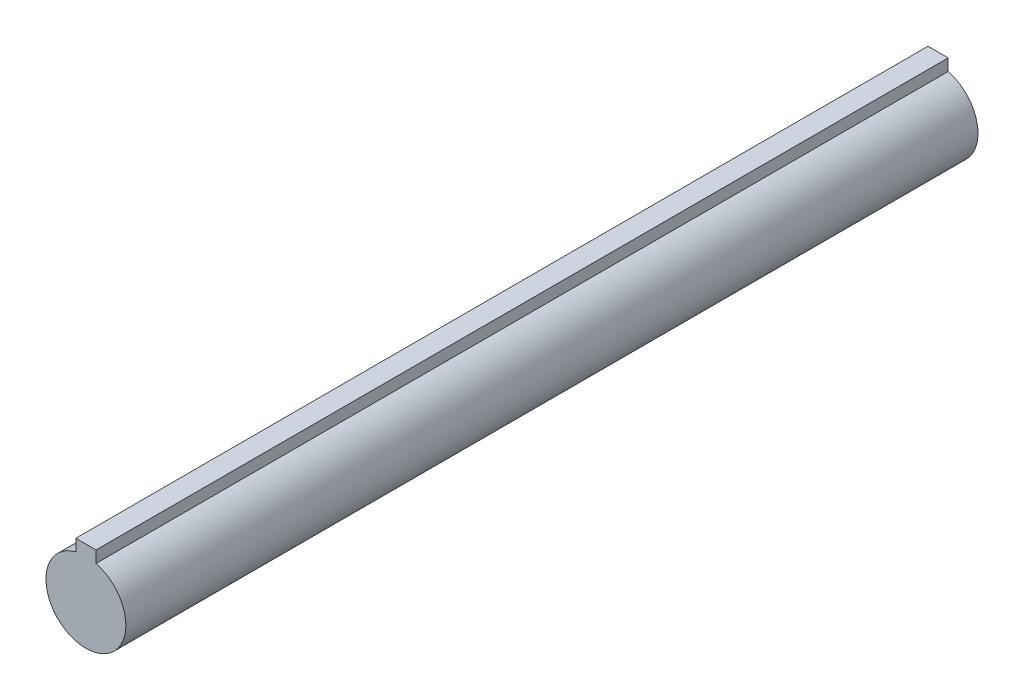
ISO-10303-21;
HEADER;
FILE_DESCRIPTION(('STEP AP214'),'2;1');
FILE_NAME('part.step','',(''),(''),'','','');
FILE_SCHEMA(('AUTOMOTIVE_DESIGN { 1 0 10303 214 1 1 1 1 }'));
ENDSEC;
DATA;
#1=APPLICATION_CONTEXT('core data for automotive mechanical design processes');
#2=APPLICATION_PROTOCOL_DEFINITION('international standard','automotive_design',2000,#1);
#3=PRODUCT_CONTEXT('',#1,'mechanical');
#4=PRODUCT('Part','Part','',(#3));
#5=PRODUCT_RELATED_PRODUCT_CATEGORY('part','',(#4));
#6=PRODUCT_DEFINITION_FORMATION('','',#4);
#7=PRODUCT_DEFINITION_CONTEXT('part definition',#1,'design');
#8=PRODUCT_DEFINITION('design','',#6,#7);
#9=PRODUCT_DEFINITION_SHAPE('','',#8);
#10=(LENGTH_UNIT() NAMED_UNIT(*) SI_UNIT(.MILLI.,.METRE.));
#11=(NAMED_UNIT(*) PLANE_ANGLE_UNIT() SI_UNIT($,.RADIAN.));
#12=(NAMED_UNIT(*) SI_UNIT($,.STERADIAN.) SOLID_ANGLE_UNIT());
#13=UNCERTAINTY_MEASURE_WITH_UNIT(LENGTH_MEASURE(1.E-05),#10,'distance_accuracy_value','');
#14=(GEOMETRIC_REPRESENTATION_CONTEXT(3) GLOBAL_UNCERTAINTY_ASSIGNED_CONTEXT((#13)) GLOBAL_UNIT_ASSIGNED_CONTEXT((#10,
#11,#12)) REPRESENTATION_CONTEXT('',''));
#15=CARTESIAN_POINT('',(0.,0.,0.));
#16=DIRECTION('',(0.,0.,1.));
#17=DIRECTION('',(1.,0.,0.));
#18=AXIS2_PLACEMENT_3D('',#15,#16,#17);
#19=CARTESIAN_POINT('',(0.,0.,203.2));
#20=DIRECTION('',(0.,0.,-1.));
#21=DIRECTION('',(-1.,0.,0.));
#22=AXIS2_PLACEMENT_3D('',#19,#20,#21);
#23=CYLINDRICAL_SURFACE('',#22,9.525);
#24=CARTESIAN_POINT('',(0.,0.,0.));
#25=DIRECTION('',(0.,0.,1.));
#26=DIRECTION('',(1.,0.,0.));
#27=AXIS2_PLACEMENT_3D('',#24,#25,#26);
#28=CIRCLE('',#27,9.525);
#29=CARTESIAN_POINT('',(-2.413,9.21428543078626,0.));
#30=VERTEX_POINT('',#29);
#31=CARTESIAN_POINT('',(2.413,9.21428543078626,0.));
#32=VERTEX_POINT('',#31);
#33=EDGE_CURVE('E107',#30,#32,#28,.T.);
#34=ORIENTED_EDGE('',*,*,#33,.T.);
#35=DIRECTION('',(0.,0.,-1.));
#36=VECTOR('',#35,1.);
#37=CARTESIAN_POINT('',(2.413,9.21428543078626,203.2));
#38=LINE('',#37,#36);
#39=CARTESIAN_POINT('',(2.413,9.21428543078626,203.2));
#40=VERTEX_POINT('',#39);
#41=EDGE_CURVE('E11',#40,#32,#38,.T.);
#42=ORIENTED_EDGE('',*,*,#41,.F.);
#43=CARTESIAN_POINT('',(0.,0.,203.2));
#44=DIRECTION('',(0.,0.,1.));
#45=DIRECTION('',(1.,0.,0.));
#46=AXIS2_PLACEMENT_3D('',#43,#44,#45);
#47=CIRCLE('',#46,9.525);
#48=CARTESIAN_POINT('',(-2.413,9.21428543078626,203.2));
#49=VERTEX_POINT('',#48);
#50=EDGE_CURVE('E91',#49,#40,#47,.T.);
#51=ORIENTED_EDGE('',*,*,#50,.F.);
#52=DIRECTION('',(0.,0.,-1.));
#53=VECTOR('',#52,1.);
#54=CARTESIAN_POINT('',(-2.413,9.21428543078626,203.2));
#55=LINE('',#54,#53);
#56=EDGE_CURVE('E103',#49,#30,#55,.T.);
#57=ORIENTED_EDGE('',*,*,#56,.T.);
#58=EDGE_LOOP('',(#34,#42,#51,#57));
#59=FACE_BOUND('',#58,.T.);
#60=ADVANCED_FACE('F39',(#59),#23,.T.);
#61=CARTESIAN_POINT('',(2.413,12.0082854307863,203.2));
#62=DIRECTION('',(-1.,0.,0.));
#63=DIRECTION('',(0.,-1.,0.));
#64=AXIS2_PLACEMENT_3D('',#61,#62,#63);
#65=PLANE('',#64);
#66=DIRECTION('',(0.,1.,0.));
#67=VECTOR('',#66,1.);
#68=CARTESIAN_POINT('',(2.413,12.0082854307863,0.));
#69=LINE('',#68,#67);
#70=CARTESIAN_POINT('',(2.413,12.0082854307863,0.));
#71=VERTEX_POINT('',#70);
#72=EDGE_CURVE('E96',#32,#71,#69,.T.);
#73=ORIENTED_EDGE('',*,*,#72,.T.);
#74=DIRECTION('',(0.,0.,-1.));
#75=VECTOR('',#74,1.);
#76=CARTESIAN_POINT('',(2.413,12.0082854307863,203.2));
#77=LINE('',#76,#75);
#78=CARTESIAN_POINT('',(2.413,12.0082854307863,203.2));
#79=VERTEX_POINT('',#78);
#80=EDGE_CURVE('E48',#79,#71,#77,.T.);
#81=ORIENTED_EDGE('',*,*,#80,.F.);
#82=DIRECTION('',(0.,1.,0.));
#83=VECTOR('',#82,1.);
#84=CARTESIAN_POINT('',(2.413,12.0082854307863,203.2));
#85=LINE('',#84,#83);
#86=EDGE_CURVE('E86',#40,#79,#85,.T.);
#87=ORIENTED_EDGE('',*,*,#86,.F.);
#88=ORIENTED_EDGE('',*,*,#41,.T.);
#89=EDGE_LOOP('',(#73,#81,#87,#88));
#90=FACE_BOUND('',#89,.T.);
#91=ADVANCED_FACE('F95',(#90),#65,.F.);
#92=CARTESIAN_POINT('',(-2.413,12.0082854307863,203.2));
#93=DIRECTION('',(0.,-1.,0.));
#94=DIRECTION('',(0.,0.,-1.));
#95=AXIS2_PLACEMENT_3D('',#92,#93,#94);
#96=PLANE('',#95);
#97=DIRECTION('',(-1.,0.,0.));
#98=VECTOR('',#97,1.);
#99=CARTESIAN_POINT('',(-2.413,12.0082854307863,0.));
#100=LINE('',#99,#98);
#101=CARTESIAN_POINT('',(-2.413,12.0082854307863,0.));
#102=VERTEX_POINT('',#101);
#103=EDGE_CURVE('E73',#71,#102,#100,.T.);
#104=ORIENTED_EDGE('',*,*,#103,.T.);
#105=DIRECTION('',(0.,0.,-1.));
#106=VECTOR('',#105,1.);
#107=CARTESIAN_POINT('',(-2.413,12.0082854307863,203.2));
#108=LINE('',#107,#106);
#109=CARTESIAN_POINT('',(-2.413,12.0082854307863,203.2));
#110=VERTEX_POINT('',#109);
#111=EDGE_CURVE('E98',#110,#102,#108,.T.);
#112=ORIENTED_EDGE('',*,*,#111,.F.);
#113=DIRECTION('',(-1.,0.,0.));
#114=VECTOR('',#113,1.);
#115=CARTESIAN_POINT('',(-2.413,12.0082854307863,203.2));
#116=LINE('',#115,#114);
#117=EDGE_CURVE('E89',#79,#110,#116,.T.);
#118=ORIENTED_EDGE('',*,*,#117,.F.);
#119=ORIENTED_EDGE('',*,*,#80,.T.);
#120=EDGE_LOOP('',(#104,#112,#118,#119));
#121=FACE_BOUND('',#120,.T.);
#122=ADVANCED_FACE('F99',(#121),#96,.F.);
#123=CARTESIAN_POINT('',(-2.413,9.21428543078626,203.2));
#124=DIRECTION('',(1.,0.,0.));
#125=DIRECTION('',(0.,1.,0.));
#126=AXIS2_PLACEMENT_3D('',#123,#124,#125);
#127=PLANE('',#126);
#128=DIRECTION('',(0.,-1.,0.));
#129=VECTOR('',#128,1.);
#130=CARTESIAN_POINT('',(-2.413,9.21428543078626,0.));
#131=LINE('',#130,#129);
#132=EDGE_CURVE('E79',#102,#30,#131,.T.);
#133=ORIENTED_EDGE('',*,*,#132,.T.);
#134=ORIENTED_EDGE('',*,*,#56,.F.);
#135=DIRECTION('',(0.,-1.,0.));
#136=VECTOR('',#135,1.);
#137=CARTESIAN_POINT('',(-2.413,9.21428543078626,203.2));
#138=LINE('',#137,#136);
#139=EDGE_CURVE('E56',#110,#49,#138,.T.);
#140=ORIENTED_EDGE('',*,*,#139,.F.);
#141=ORIENTED_EDGE('',*,*,#111,.T.);
#142=EDGE_LOOP('',(#133,#134,#140,#141));
#143=FACE_BOUND('',#142,.T.);
#144=ADVANCED_FACE('F120',(#143),#127,.F.);
#145=CARTESIAN_POINT('',(0.,0.,203.2));
#146=DIRECTION('',(0.,0.,1.));
#147=DIRECTION('',(1.,0.,0.));
#148=AXIS2_PLACEMENT_3D('',#145,#146,#147);
#149=PLANE('',#148);
#150=ORIENTED_EDGE('',*,*,#50,.T.);
#151=ORIENTED_EDGE('',*,*,#86,.T.);
#152=ORIENTED_EDGE('',*,*,#117,.T.);
#153=ORIENTED_EDGE('',*,*,#139,.T.);
#154=EDGE_LOOP('',(#150,#151,#152,#153));
#155=FACE_BOUND('',#154,.T.);
#156=ADVANCED_FACE('F87',(#155),#149,.T.);
#157=CARTESIAN_POINT('',(0.,0.,0.));
#158=DIRECTION('',(0.,0.,1.));
#159=DIRECTION('',(1.,0.,0.));
#160=AXIS2_PLACEMENT_3D('',#157,#158,#159);
#161=PLANE('',#160);
#162=ORIENTED_EDGE('',*,*,#33,.F.);
#163=ORIENTED_EDGE('',*,*,#132,.F.);
#164=ORIENTED_EDGE('',*,*,#103,.F.);
#165=ORIENTED_EDGE('',*,*,#72,.F.);
#166=EDGE_LOOP('',(#162,#163,#164,#165));
#167=FACE_BOUND('',#166,.T.);
#168=ADVANCED_FACE('F123',(#167),#161,.F.);
#169=CLOSED_SHELL('',(#60,#91,#122,#144,#156,#168));
#170=MANIFOLD_SOLID_BREP('B2',#169);
#171=ADVANCED_BREP_SHAPE_REPRESENTATION('',(#18,#170),#14);
#172=SHAPE_DEFINITION_REPRESENTATION(#9,#171);
ENDSEC;
END-ISO-10303-21;
